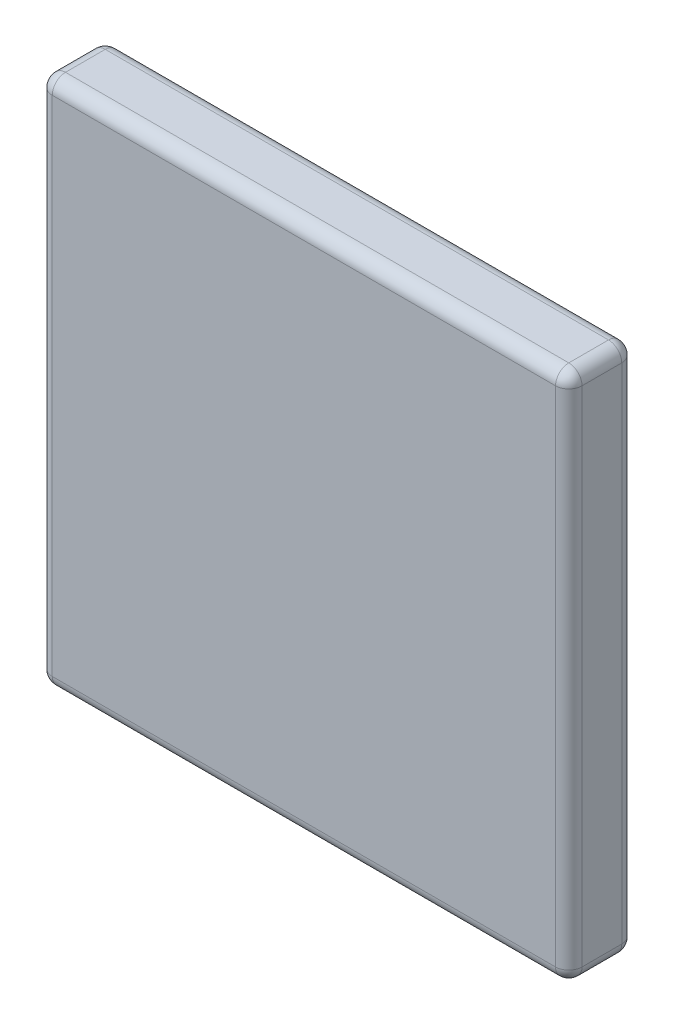
ISO-10303-21;
HEADER;
FILE_DESCRIPTION(('STEP AP214'),'2;1');
FILE_NAME('part.step','',(''),(''),'','','');
FILE_SCHEMA(('AUTOMOTIVE_DESIGN { 1 0 10303 214 1 1 1 1 }'));
ENDSEC;
DATA;
#1=APPLICATION_CONTEXT('core data for automotive mechanical design processes');
#2=APPLICATION_PROTOCOL_DEFINITION('international standard','automotive_design',2000,#1);
#3=PRODUCT_CONTEXT('',#1,'mechanical');
#4=PRODUCT('Part','Part','',(#3));
#5=PRODUCT_RELATED_PRODUCT_CATEGORY('part','',(#4));
#6=PRODUCT_DEFINITION_FORMATION('','',#4);
#7=PRODUCT_DEFINITION_CONTEXT('part definition',#1,'design');
#8=PRODUCT_DEFINITION('design','',#6,#7);
#9=PRODUCT_DEFINITION_SHAPE('','',#8);
#10=(LENGTH_UNIT() NAMED_UNIT(*) SI_UNIT(.MILLI.,.METRE.));
#11=(NAMED_UNIT(*) PLANE_ANGLE_UNIT() SI_UNIT($,.RADIAN.));
#12=(NAMED_UNIT(*) SI_UNIT($,.STERADIAN.) SOLID_ANGLE_UNIT());
#13=UNCERTAINTY_MEASURE_WITH_UNIT(LENGTH_MEASURE(1.E-05),#10,'distance_accuracy_value','');
#14=(GEOMETRIC_REPRESENTATION_CONTEXT(3) GLOBAL_UNCERTAINTY_ASSIGNED_CONTEXT((#13)) GLOBAL_UNIT_ASSIGNED_CONTEXT((#10,
#11,#12)) REPRESENTATION_CONTEXT('',''));
#15=CARTESIAN_POINT('',(0.,0.,0.));
#16=DIRECTION('',(0.,0.,1.));
#17=DIRECTION('',(1.,0.,0.));
#18=AXIS2_PLACEMENT_3D('',#15,#16,#17);
#19=CARTESIAN_POINT('',(-11.1135503341585,-6.92052800232944,0.900000000000082));
#20=DIRECTION('',(0.408248290462725,-0.816496580928247,0.408248290463959));
#21=DIRECTION('',(-0.912870929175786,-0.365148371669073,0.182574185834587));
#22=AXIS2_PLACEMENT_3D('',#19,#20,#21);
#23=SPHERICAL_SURFACE('',#22,0.0999999999998183);
#24=CARTESIAN_POINT('',(-11.1135503341584,-6.92052800232929,0.899999999999967));
#25=DIRECTION('',(-1.,0.,0.));
#26=DIRECTION('',(0.,-1.,0.));
#27=AXIS2_PLACEMENT_3D('',#24,#25,#26);
#28=CIRCLE('',#27,0.0999999999999996);
#29=CARTESIAN_POINT('',(-11.1135503341585,-7.02052800232926,0.899999999999986));
#30=VERTEX_POINT('',#29);
#31=CARTESIAN_POINT('',(-11.1135503341584,-6.92052800232928,0.799999999999992));
#32=VERTEX_POINT('',#31);
#33=EDGE_CURVE('E108',#30,#32,#28,.F.);
#34=ORIENTED_EDGE('',*,*,#33,.F.);
#35=CARTESIAN_POINT('',(-11.1135503341585,-6.92052800232926,0.900000000000005));
#36=DIRECTION('',(0.,0.,-1.));
#37=DIRECTION('',(-1.,0.,0.));
#38=AXIS2_PLACEMENT_3D('',#35,#36,#37);
#39=CIRCLE('',#38,0.0999999999999487);
#40=CARTESIAN_POINT('',(-11.2135503341584,-6.92052800232926,0.900000000000002));
#41=VERTEX_POINT('',#40);
#42=EDGE_CURVE('E20',#41,#30,#39,.F.);
#43=ORIENTED_EDGE('',*,*,#42,.F.);
#44=CARTESIAN_POINT('',(-11.1135503341584,-6.92052800232926,0.9));
#45=DIRECTION('',(0.,1.,0.));
#46=DIRECTION('',(0.,0.,1.));
#47=AXIS2_PLACEMENT_3D('',#44,#45,#46);
#48=CIRCLE('',#47,0.0999999999999994);
#49=EDGE_CURVE('E106',#32,#41,#48,.T.);
#50=ORIENTED_EDGE('',*,*,#49,.F.);
#51=EDGE_LOOP('',(#34,#43,#50));
#52=FACE_BOUND('',#51,.T.);
#53=ADVANCED_FACE('F16',(#52),#23,.T.);
#54=CARTESIAN_POINT('',(-11.1135503341585,-3.12052800232929,0.900000000000006));
#55=DIRECTION('',(-0.408248290463386,-0.816496580927873,-0.408248290464046));
#56=DIRECTION('',(-0.91287092917549,0.365148371669745,0.18257418583472));
#57=AXIS2_PLACEMENT_3D('',#54,#55,#56);
#58=SPHERICAL_SURFACE('',#57,0.0999999999998985);
#59=CARTESIAN_POINT('',(-11.1135503341584,-3.12052800232926,0.9));
#60=DIRECTION('',(1.,0.,0.));
#61=DIRECTION('',(0.,0.,-1.));
#62=AXIS2_PLACEMENT_3D('',#59,#60,#61);
#63=CIRCLE('',#62,0.0999999999999999);
#64=CARTESIAN_POINT('',(-11.1135503341584,-3.12052800232926,0.800000000000008));
#65=VERTEX_POINT('',#64);
#66=CARTESIAN_POINT('',(-11.1135503341584,-3.02052800232926,0.9));
#67=VERTEX_POINT('',#66);
#68=EDGE_CURVE('E198',#65,#67,#63,.T.);
#69=ORIENTED_EDGE('',*,*,#68,.F.);
#70=CARTESIAN_POINT('',(-11.1135503341584,-3.12052800232926,0.900000000000033));
#71=DIRECTION('',(0.,1.,0.));
#72=DIRECTION('',(0.,0.,1.));
#73=AXIS2_PLACEMENT_3D('',#70,#71,#72);
#74=CIRCLE('',#73,0.0999999999999994);
#75=CARTESIAN_POINT('',(-11.2135503341584,-3.12052800232926,0.900000000000017));
#76=VERTEX_POINT('',#75);
#77=EDGE_CURVE('E136',#76,#65,#74,.F.);
#78=ORIENTED_EDGE('',*,*,#77,.F.);
#79=CARTESIAN_POINT('',(-11.1135503341584,-3.12052800232926,0.9));
#80=DIRECTION('',(0.,0.,-1.));
#81=DIRECTION('',(-1.,0.,0.));
#82=AXIS2_PLACEMENT_3D('',#79,#80,#81);
#83=CIRCLE('',#82,0.0999999999999997);
#84=EDGE_CURVE('E112',#67,#76,#83,.F.);
#85=ORIENTED_EDGE('',*,*,#84,.F.);
#86=EDGE_LOOP('',(#69,#78,#85));
#87=FACE_BOUND('',#86,.T.);
#88=ADVANCED_FACE('F212',(#87),#58,.T.);
#89=CARTESIAN_POINT('',(-11.1135503341585,-6.92052800232926,1.2));
#90=DIRECTION('',(0.,0.,-1.));
#91=DIRECTION('',(-1.,0.,0.));
#92=AXIS2_PLACEMENT_3D('',#89,#90,#91);
#93=CYLINDRICAL_SURFACE('',#92,0.0999999999999487);
#94=ORIENTED_EDGE('',*,*,#42,.T.);
#95=DIRECTION('',(0.,0.,-1.));
#96=VECTOR('',#95,1.);
#97=CARTESIAN_POINT('',(-11.1135503341584,-7.02052800232926,1.05));
#98=LINE('',#97,#96);
#99=CARTESIAN_POINT('',(-11.1135503341585,-7.02052800232926,1.2));
#100=VERTEX_POINT('',#99);
#101=EDGE_CURVE('E195',#100,#30,#98,.T.);
#102=ORIENTED_EDGE('',*,*,#101,.F.);
#103=CARTESIAN_POINT('',(-11.1135503341585,-6.92052800232926,1.2));
#104=DIRECTION('',(0.,0.,-1.));
#105=DIRECTION('',(-1.,0.,0.));
#106=AXIS2_PLACEMENT_3D('',#103,#104,#105);
#107=CIRCLE('',#106,0.0999999999999487);
#108=CARTESIAN_POINT('',(-11.2135503341584,-6.92052800232926,1.2));
#109=VERTEX_POINT('',#108);
#110=EDGE_CURVE('E117',#109,#100,#107,.F.);
#111=ORIENTED_EDGE('',*,*,#110,.F.);
#112=DIRECTION('',(0.,0.,1.));
#113=VECTOR('',#112,1.);
#114=CARTESIAN_POINT('',(-11.2135503341584,-6.92052800232926,1.05));
#115=LINE('',#114,#113);
#116=EDGE_CURVE('E114',#41,#109,#115,.T.);
#117=ORIENTED_EDGE('',*,*,#116,.F.);
#118=EDGE_LOOP('',(#94,#102,#111,#117));
#119=FACE_BOUND('',#118,.T.);
#120=ADVANCED_FACE('F115',(#119),#93,.T.);
#121=CARTESIAN_POINT('',(-11.1135503341584,-3.12052800232926,1.2));
#122=DIRECTION('',(0.,0.,-1.));
#123=DIRECTION('',(-1.,0.,0.));
#124=AXIS2_PLACEMENT_3D('',#121,#122,#123);
#125=CYLINDRICAL_SURFACE('',#124,0.0999999999999997);
#126=ORIENTED_EDGE('',*,*,#84,.T.);
#127=DIRECTION('',(0.,0.,-1.));
#128=VECTOR('',#127,1.);
#129=CARTESIAN_POINT('',(-11.2135503341584,-3.12052800232926,1.05));
#130=LINE('',#129,#128);
#131=CARTESIAN_POINT('',(-11.2135503341584,-3.12052800232925,1.19999999999998));
#132=VERTEX_POINT('',#131);
#133=EDGE_CURVE('E123',#132,#76,#130,.T.);
#134=ORIENTED_EDGE('',*,*,#133,.F.);
#135=CARTESIAN_POINT('',(-11.1135503341584,-3.12052800232926,1.2));
#136=DIRECTION('',(0.,0.,-1.));
#137=DIRECTION('',(-1.,0.,0.));
#138=AXIS2_PLACEMENT_3D('',#135,#136,#137);
#139=CIRCLE('',#138,0.0999999999999997);
#140=CARTESIAN_POINT('',(-11.1135503341584,-3.02052800232926,1.2));
#141=VERTEX_POINT('',#140);
#142=EDGE_CURVE('E192',#141,#132,#139,.F.);
#143=ORIENTED_EDGE('',*,*,#142,.F.);
#144=DIRECTION('',(0.,0.,1.));
#145=VECTOR('',#144,1.);
#146=CARTESIAN_POINT('',(-11.1135503341584,-3.02052800232926,1.05));
#147=LINE('',#146,#145);
#148=EDGE_CURVE('E209',#67,#141,#147,.T.);
#149=ORIENTED_EDGE('',*,*,#148,.F.);
#150=EDGE_LOOP('',(#126,#134,#143,#149));
#151=FACE_BOUND('',#150,.T.);
#152=ADVANCED_FACE('F207',(#151),#125,.T.);
#153=CARTESIAN_POINT('',(-7.31355033415845,-6.92052800232926,0.9));
#154=DIRECTION('',(-1.,0.,0.));
#155=DIRECTION('',(0.,-1.,0.));
#156=AXIS2_PLACEMENT_3D('',#153,#154,#155);
#157=CYLINDRICAL_SURFACE('',#156,0.0999999999999996);
#158=ORIENTED_EDGE('',*,*,#33,.T.);
#159=DIRECTION('',(-1.,0.,0.));
#160=VECTOR('',#159,1.);
#161=CARTESIAN_POINT('',(-9.21355033415842,-6.92052800232926,0.8));
#162=LINE('',#161,#160);
#163=CARTESIAN_POINT('',(-7.31355033415844,-6.92052800232926,0.799999999999996));
#164=VERTEX_POINT('',#163);
#165=EDGE_CURVE('E225',#164,#32,#162,.T.);
#166=ORIENTED_EDGE('',*,*,#165,.F.);
#167=CARTESIAN_POINT('',(-7.31355033415845,-6.92052800232926,0.9));
#168=DIRECTION('',(-1.,0.,0.));
#169=DIRECTION('',(0.,-1.,0.));
#170=AXIS2_PLACEMENT_3D('',#167,#168,#169);
#171=CIRCLE('',#170,0.0999999999999996);
#172=CARTESIAN_POINT('',(-7.31355033415845,-7.02052800232926,0.9));
#173=VERTEX_POINT('',#172);
#174=EDGE_CURVE('E203',#164,#173,#171,.T.);
#175=ORIENTED_EDGE('',*,*,#174,.T.);
#176=DIRECTION('',(1.,0.,0.));
#177=VECTOR('',#176,1.);
#178=CARTESIAN_POINT('',(-9.21355033415842,-7.02052800232926,0.9));
#179=LINE('',#178,#177);
#180=EDGE_CURVE('E140',#30,#173,#179,.T.);
#181=ORIENTED_EDGE('',*,*,#180,.F.);
#182=EDGE_LOOP('',(#158,#166,#175,#181));
#183=FACE_BOUND('',#182,.T.);
#184=ADVANCED_FACE('F467',(#183),#157,.T.);
#185=CARTESIAN_POINT('',(-11.1135503341584,-6.92052800232926,0.9));
#186=DIRECTION('',(0.,1.,0.));
#187=DIRECTION('',(0.,0.,1.));
#188=AXIS2_PLACEMENT_3D('',#185,#186,#187);
#189=CYLINDRICAL_SURFACE('',#188,0.0999999999999994);
#190=ORIENTED_EDGE('',*,*,#77,.T.);
#191=DIRECTION('',(0.,1.,0.));
#192=VECTOR('',#191,1.);
#193=CARTESIAN_POINT('',(-11.1135503341584,-5.02052800232926,0.8));
#194=LINE('',#193,#192);
#195=EDGE_CURVE('E134',#32,#65,#194,.T.);
#196=ORIENTED_EDGE('',*,*,#195,.F.);
#197=ORIENTED_EDGE('',*,*,#49,.T.);
#198=DIRECTION('',(0.,-1.,0.));
#199=VECTOR('',#198,1.);
#200=CARTESIAN_POINT('',(-11.2135503341584,-5.02052800232926,0.9));
#201=LINE('',#200,#199);
#202=EDGE_CURVE('E131',#76,#41,#201,.T.);
#203=ORIENTED_EDGE('',*,*,#202,.F.);
#204=EDGE_LOOP('',(#190,#196,#197,#203));
#205=FACE_BOUND('',#204,.T.);
#206=ADVANCED_FACE('F130',(#205),#189,.T.);
#207=CARTESIAN_POINT('',(-11.1135503341584,-3.12052800232926,0.9));
#208=DIRECTION('',(1.,0.,0.));
#209=DIRECTION('',(0.,0.,-1.));
#210=AXIS2_PLACEMENT_3D('',#207,#208,#209);
#211=CYLINDRICAL_SURFACE('',#210,0.0999999999999999);
#212=CARTESIAN_POINT('',(-7.31355033415845,-3.12052800232926,0.9));
#213=DIRECTION('',(1.,0.,0.));
#214=DIRECTION('',(0.,0.,-1.));
#215=AXIS2_PLACEMENT_3D('',#212,#213,#214);
#216=CIRCLE('',#215,0.0999999999999999);
#217=CARTESIAN_POINT('',(-7.31355033415845,-3.02052800232926,0.9));
#218=VERTEX_POINT('',#217);
#219=CARTESIAN_POINT('',(-7.31355033415845,-3.12052800232926,0.8));
#220=VERTEX_POINT('',#219);
#221=EDGE_CURVE('E124',#218,#220,#216,.F.);
#222=ORIENTED_EDGE('',*,*,#221,.T.);
#223=DIRECTION('',(1.,0.,0.));
#224=VECTOR('',#223,1.);
#225=CARTESIAN_POINT('',(-9.21355033415842,-3.12052800232926,0.8));
#226=LINE('',#225,#224);
#227=EDGE_CURVE('E191',#65,#220,#226,.T.);
#228=ORIENTED_EDGE('',*,*,#227,.F.);
#229=ORIENTED_EDGE('',*,*,#68,.T.);
#230=DIRECTION('',(-1.,0.,0.));
#231=VECTOR('',#230,1.);
#232=CARTESIAN_POINT('',(-9.21355033415842,-3.02052800232926,0.9));
#233=LINE('',#232,#231);
#234=EDGE_CURVE('E194',#218,#67,#233,.T.);
#235=ORIENTED_EDGE('',*,*,#234,.F.);
#236=EDGE_LOOP('',(#222,#228,#229,#235));
#237=FACE_BOUND('',#236,.T.);
#238=ADVANCED_FACE('F216',(#237),#211,.T.);
#239=CARTESIAN_POINT('',(-11.2135503341584,-3.12052800232926,0.9));
#240=DIRECTION('',(-1.,0.,0.));
#241=DIRECTION('',(0.,-1.,0.));
#242=AXIS2_PLACEMENT_3D('',#239,#240,#241);
#243=PLANE('',#242);
#244=ORIENTED_EDGE('',*,*,#133,.T.);
#245=ORIENTED_EDGE('',*,*,#202,.T.);
#246=ORIENTED_EDGE('',*,*,#116,.T.);
#247=DIRECTION('',(0.,-1.,0.));
#248=VECTOR('',#247,1.);
#249=CARTESIAN_POINT('',(-11.2135503341584,-5.02052800232926,1.2));
#250=LINE('',#249,#248);
#251=EDGE_CURVE('E184',#132,#109,#250,.T.);
#252=ORIENTED_EDGE('',*,*,#251,.F.);
#253=EDGE_LOOP('',(#244,#245,#246,#252));
#254=FACE_BOUND('',#253,.T.);
#255=ADVANCED_FACE('F138',(#254),#243,.T.);
#256=CARTESIAN_POINT('',(-11.1135503341584,-6.92052800232923,1.19999999999998));
#257=DIRECTION('',(0.408248290463794,-0.816496580928217,-0.408248290462949));
#258=DIRECTION('',(0.182574185834408,-0.365148371669412,0.912870929175686));
#259=AXIS2_PLACEMENT_3D('',#256,#257,#258);
#260=SPHERICAL_SURFACE('',#259,0.100000000000031);
#261=ORIENTED_EDGE('',*,*,#110,.T.);
#262=CARTESIAN_POINT('',(-11.1135503341584,-6.92052800232929,1.20000000000003));
#263=DIRECTION('',(-1.,0.,0.));
#264=DIRECTION('',(0.,-1.,0.));
#265=AXIS2_PLACEMENT_3D('',#262,#263,#264);
#266=CIRCLE('',#265,0.0999999999999997);
#267=CARTESIAN_POINT('',(-11.1135503341584,-6.92052800232928,1.30000000000001));
#268=VERTEX_POINT('',#267);
#269=EDGE_CURVE('E179',#268,#100,#266,.F.);
#270=ORIENTED_EDGE('',*,*,#269,.F.);
#271=CARTESIAN_POINT('',(-11.1135503341584,-6.92052800232926,1.2));
#272=DIRECTION('',(0.,1.,0.));
#273=DIRECTION('',(-1.,0.,0.));
#274=AXIS2_PLACEMENT_3D('',#271,#272,#273);
#275=CIRCLE('',#274,0.0999999999999999);
#276=EDGE_CURVE('E188',#109,#268,#275,.T.);
#277=ORIENTED_EDGE('',*,*,#276,.F.);
#278=EDGE_LOOP('',(#261,#270,#277));
#279=FACE_BOUND('',#278,.T.);
#280=ADVANCED_FACE('F291',(#279),#260,.T.);
#281=CARTESIAN_POINT('',(-11.1135503341584,-7.02052800232926,0.9));
#282=DIRECTION('',(0.,-1.,0.));
#283=DIRECTION('',(1.,0.,0.));
#284=AXIS2_PLACEMENT_3D('',#281,#282,#283);
#285=PLANE('',#284);
#286=DIRECTION('',(1.,0.,0.));
#287=VECTOR('',#286,1.);
#288=CARTESIAN_POINT('',(-9.21355033415842,-7.02052800232926,1.2));
#289=LINE('',#288,#287);
#290=CARTESIAN_POINT('',(-7.31355033415845,-7.02052800232926,1.2));
#291=VERTEX_POINT('',#290);
#292=EDGE_CURVE('E178',#100,#291,#289,.T.);
#293=ORIENTED_EDGE('',*,*,#292,.F.);
#294=ORIENTED_EDGE('',*,*,#101,.T.);
#295=ORIENTED_EDGE('',*,*,#180,.T.);
#296=DIRECTION('',(0.,0.,1.));
#297=VECTOR('',#296,1.);
#298=CARTESIAN_POINT('',(-7.31355033415845,-7.02052800232926,1.05));
#299=LINE('',#298,#297);
#300=EDGE_CURVE('E239',#173,#291,#299,.T.);
#301=ORIENTED_EDGE('',*,*,#300,.T.);
#302=EDGE_LOOP('',(#293,#294,#295,#301));
#303=FACE_BOUND('',#302,.T.);
#304=ADVANCED_FACE('F287',(#303),#285,.T.);
#305=CARTESIAN_POINT('',(-11.1135503341585,-3.12052800232924,1.19999999999999));
#306=DIRECTION('',(-0.408248290463997,-0.816496580927973,0.408248290463235));
#307=DIRECTION('',(0.182574185835505,0.365148371669184,0.912870929175558));
#308=AXIS2_PLACEMENT_3D('',#305,#306,#307);
#309=SPHERICAL_SURFACE('',#308,0.10000000000001);
#310=ORIENTED_EDGE('',*,*,#142,.T.);
#311=CARTESIAN_POINT('',(-11.1135503341584,-3.12052800232925,1.19999999999997));
#312=DIRECTION('',(0.,1.,0.));
#313=DIRECTION('',(-1.,0.,0.));
#314=AXIS2_PLACEMENT_3D('',#311,#312,#313);
#315=CIRCLE('',#314,0.0999999999999999);
#316=CARTESIAN_POINT('',(-11.1135503341584,-3.12052800232925,1.29999999999999));
#317=VERTEX_POINT('',#316);
#318=EDGE_CURVE('E185',#317,#132,#315,.F.);
#319=ORIENTED_EDGE('',*,*,#318,.F.);
#320=CARTESIAN_POINT('',(-11.1135503341584,-3.12052800232926,1.2));
#321=DIRECTION('',(1.,0.,0.));
#322=DIRECTION('',(0.,0.,-1.));
#323=AXIS2_PLACEMENT_3D('',#320,#321,#322);
#324=CIRCLE('',#323,0.1);
#325=EDGE_CURVE('E175',#141,#317,#324,.T.);
#326=ORIENTED_EDGE('',*,*,#325,.F.);
#327=EDGE_LOOP('',(#310,#319,#326));
#328=FACE_BOUND('',#327,.T.);
#329=ADVANCED_FACE('F249',(#328),#309,.T.);
#330=CARTESIAN_POINT('',(-7.31355033415845,-3.02052800232926,0.9));
#331=DIRECTION('',(0.,1.,0.));
#332=DIRECTION('',(-1.,0.,0.));
#333=AXIS2_PLACEMENT_3D('',#330,#331,#332);
#334=PLANE('',#333);
#335=DIRECTION('',(-1.,0.,0.));
#336=VECTOR('',#335,1.);
#337=CARTESIAN_POINT('',(-9.21355033415842,-3.02052800232926,1.2));
#338=LINE('',#337,#336);
#339=CARTESIAN_POINT('',(-7.31355033415845,-3.02052800232926,1.2));
#340=VERTEX_POINT('',#339);
#341=EDGE_CURVE('E174',#340,#141,#338,.T.);
#342=ORIENTED_EDGE('',*,*,#341,.F.);
#343=DIRECTION('',(0.,0.,-1.));
#344=VECTOR('',#343,1.);
#345=CARTESIAN_POINT('',(-7.31355033415845,-3.02052800232926,1.05));
#346=LINE('',#345,#344);
#347=EDGE_CURVE('E227',#340,#218,#346,.T.);
#348=ORIENTED_EDGE('',*,*,#347,.T.);
#349=ORIENTED_EDGE('',*,*,#234,.T.);
#350=ORIENTED_EDGE('',*,*,#148,.T.);
#351=EDGE_LOOP('',(#342,#348,#349,#350));
#352=FACE_BOUND('',#351,.T.);
#353=ADVANCED_FACE('F424',(#352),#334,.T.);
#354=CARTESIAN_POINT('',(-7.31355033415845,-6.92052800232926,0.8));
#355=DIRECTION('',(0.,0.,-1.));
#356=DIRECTION('',(-1.,0.,0.));
#357=AXIS2_PLACEMENT_3D('',#354,#355,#356);
#358=PLANE('',#357);
#359=ORIENTED_EDGE('',*,*,#195,.T.);
#360=ORIENTED_EDGE('',*,*,#227,.T.);
#361=DIRECTION('',(0.,1.,0.));
#362=VECTOR('',#361,1.);
#363=CARTESIAN_POINT('',(-7.31355033415845,-5.02052800232926,0.8));
#364=LINE('',#363,#362);
#365=EDGE_CURVE('E170',#164,#220,#364,.T.);
#366=ORIENTED_EDGE('',*,*,#365,.F.);
#367=ORIENTED_EDGE('',*,*,#165,.T.);
#368=EDGE_LOOP('',(#359,#360,#366,#367));
#369=FACE_BOUND('',#368,.T.);
#370=ADVANCED_FACE('F223',(#369),#358,.T.);
#371=CARTESIAN_POINT('',(-7.31355033415846,-3.12052800232928,0.899999999999996));
#372=DIRECTION('',(0.40824829046393,-0.816496580927607,-0.408248290464035));
#373=DIRECTION('',(-0.182574185835001,0.36514837167033,-0.9128709291752));
#374=AXIS2_PLACEMENT_3D('',#371,#372,#373);
#375=SPHERICAL_SURFACE('',#374,0.0999999999999972);
#376=CARTESIAN_POINT('',(-7.31355033415845,-3.12052800232926,0.9));
#377=DIRECTION('',(0.,-1.,0.));
#378=DIRECTION('',(1.,0.,0.));
#379=AXIS2_PLACEMENT_3D('',#376,#377,#378);
#380=CIRCLE('',#379,0.0999999999999996);
#381=CARTESIAN_POINT('',(-7.21355033415845,-3.12052800232926,0.9));
#382=VERTEX_POINT('',#381);
#383=EDGE_CURVE('E171',#220,#382,#380,.T.);
#384=ORIENTED_EDGE('',*,*,#383,.F.);
#385=ORIENTED_EDGE('',*,*,#221,.F.);
#386=CARTESIAN_POINT('',(-7.31355033415845,-3.12052800232926,0.9));
#387=DIRECTION('',(0.,0.,-1.));
#388=DIRECTION('',(-1.,0.,0.));
#389=AXIS2_PLACEMENT_3D('',#386,#387,#388);
#390=CIRCLE('',#389,0.0999999999999995);
#391=EDGE_CURVE('E167',#382,#218,#390,.F.);
#392=ORIENTED_EDGE('',*,*,#391,.F.);
#393=EDGE_LOOP('',(#384,#385,#392));
#394=FACE_BOUND('',#393,.T.);
#395=ADVANCED_FACE('F408',(#394),#375,.T.);
#396=CARTESIAN_POINT('',(-11.1135503341584,-6.92052800232926,1.2));
#397=DIRECTION('',(0.,1.,0.));
#398=DIRECTION('',(-1.,0.,0.));
#399=AXIS2_PLACEMENT_3D('',#396,#397,#398);
#400=CYLINDRICAL_SURFACE('',#399,0.0999999999999999);
#401=ORIENTED_EDGE('',*,*,#318,.T.);
#402=ORIENTED_EDGE('',*,*,#251,.T.);
#403=ORIENTED_EDGE('',*,*,#276,.T.);
#404=DIRECTION('',(0.,-1.,0.));
#405=VECTOR('',#404,1.);
#406=CARTESIAN_POINT('',(-11.1135503341584,-5.02052800232926,1.3));
#407=LINE('',#406,#405);
#408=EDGE_CURVE('E160',#317,#268,#407,.T.);
#409=ORIENTED_EDGE('',*,*,#408,.F.);
#410=EDGE_LOOP('',(#401,#402,#403,#409));
#411=FACE_BOUND('',#410,.T.);
#412=ADVANCED_FACE('F243',(#411),#400,.T.);
#413=CARTESIAN_POINT('',(-7.31355033415845,-6.92052800232926,1.2));
#414=DIRECTION('',(-1.,0.,0.));
#415=DIRECTION('',(0.,-1.,0.));
#416=AXIS2_PLACEMENT_3D('',#413,#414,#415);
#417=CYLINDRICAL_SURFACE('',#416,0.0999999999999997);
#418=ORIENTED_EDGE('',*,*,#269,.T.);
#419=ORIENTED_EDGE('',*,*,#292,.T.);
#420=CARTESIAN_POINT('',(-7.31355033415845,-6.92052800232926,1.2));
#421=DIRECTION('',(-1.,0.,0.));
#422=DIRECTION('',(0.,-1.,0.));
#423=AXIS2_PLACEMENT_3D('',#420,#421,#422);
#424=CIRCLE('',#423,0.0999999999999997);
#425=CARTESIAN_POINT('',(-7.31355033415844,-6.92052800232926,1.3));
#426=VERTEX_POINT('',#425);
#427=EDGE_CURVE('E182',#291,#426,#424,.T.);
#428=ORIENTED_EDGE('',*,*,#427,.T.);
#429=DIRECTION('',(1.,0.,0.));
#430=VECTOR('',#429,1.);
#431=CARTESIAN_POINT('',(-9.21355033415842,-6.92052800232926,1.3));
#432=LINE('',#431,#430);
#433=EDGE_CURVE('E261',#268,#426,#432,.T.);
#434=ORIENTED_EDGE('',*,*,#433,.F.);
#435=EDGE_LOOP('',(#418,#419,#428,#434));
#436=FACE_BOUND('',#435,.T.);
#437=ADVANCED_FACE('F289',(#436),#417,.T.);
#438=CARTESIAN_POINT('',(-11.1135503341584,-3.12052800232926,1.2));
#439=DIRECTION('',(1.,0.,0.));
#440=DIRECTION('',(0.,0.,-1.));
#441=AXIS2_PLACEMENT_3D('',#438,#439,#440);
#442=CYLINDRICAL_SURFACE('',#441,0.1);
#443=CARTESIAN_POINT('',(-7.31355033415845,-3.12052800232926,1.2));
#444=DIRECTION('',(1.,0.,0.));
#445=DIRECTION('',(0.,0.,-1.));
#446=AXIS2_PLACEMENT_3D('',#443,#444,#445);
#447=CIRCLE('',#446,0.1);
#448=CARTESIAN_POINT('',(-7.31355033415845,-3.12052800232926,1.3));
#449=VERTEX_POINT('',#448);
#450=EDGE_CURVE('E157',#340,#449,#447,.T.);
#451=ORIENTED_EDGE('',*,*,#450,.F.);
#452=ORIENTED_EDGE('',*,*,#341,.T.);
#453=ORIENTED_EDGE('',*,*,#325,.T.);
#454=DIRECTION('',(-1.,0.,0.));
#455=VECTOR('',#454,1.);
#456=CARTESIAN_POINT('',(-9.21355033415842,-3.12052800232926,1.3));
#457=LINE('',#456,#455);
#458=EDGE_CURVE('E254',#449,#317,#457,.T.);
#459=ORIENTED_EDGE('',*,*,#458,.F.);
#460=EDGE_LOOP('',(#451,#452,#453,#459));
#461=FACE_BOUND('',#460,.T.);
#462=ADVANCED_FACE('F253',(#461),#442,.T.);
#463=CARTESIAN_POINT('',(-7.31355033415845,-3.12052800232926,0.9));
#464=DIRECTION('',(0.,-1.,0.));
#465=DIRECTION('',(1.,0.,0.));
#466=AXIS2_PLACEMENT_3D('',#463,#464,#465);
#467=CYLINDRICAL_SURFACE('',#466,0.0999999999999996);
#468=CARTESIAN_POINT('',(-7.31355033415843,-6.92052800232926,0.899999999999984));
#469=DIRECTION('',(0.,-1.,0.));
#470=DIRECTION('',(1.,0.,0.));
#471=AXIS2_PLACEMENT_3D('',#468,#469,#470);
#472=CIRCLE('',#471,0.0999999999999996);
#473=CARTESIAN_POINT('',(-7.21355033415844,-6.92052800232926,0.899999999999992));
#474=VERTEX_POINT('',#473);
#475=EDGE_CURVE('E164',#164,#474,#472,.T.);
#476=ORIENTED_EDGE('',*,*,#475,.F.);
#477=ORIENTED_EDGE('',*,*,#365,.T.);
#478=ORIENTED_EDGE('',*,*,#383,.T.);
#479=DIRECTION('',(0.,1.,0.));
#480=VECTOR('',#479,1.);
#481=CARTESIAN_POINT('',(-7.21355033415845,-5.02052800232926,0.9));
#482=LINE('',#481,#480);
#483=EDGE_CURVE('E260',#474,#382,#482,.T.);
#484=ORIENTED_EDGE('',*,*,#483,.F.);
#485=EDGE_LOOP('',(#476,#477,#478,#484));
#486=FACE_BOUND('',#485,.T.);
#487=ADVANCED_FACE('F272',(#486),#467,.T.);
#488=CARTESIAN_POINT('',(-7.31355033415845,-3.12052800232926,1.2));
#489=DIRECTION('',(0.,0.,-1.));
#490=DIRECTION('',(-1.,0.,0.));
#491=AXIS2_PLACEMENT_3D('',#488,#489,#490);
#492=CYLINDRICAL_SURFACE('',#491,0.0999999999999995);
#493=ORIENTED_EDGE('',*,*,#391,.T.);
#494=ORIENTED_EDGE('',*,*,#347,.F.);
#495=CARTESIAN_POINT('',(-7.31355033415845,-3.12052800232926,1.2));
#496=DIRECTION('',(0.,0.,-1.));
#497=DIRECTION('',(-1.,0.,0.));
#498=AXIS2_PLACEMENT_3D('',#495,#496,#497);
#499=CIRCLE('',#498,0.0999999999999995);
#500=CARTESIAN_POINT('',(-7.21355033415845,-3.12052800232926,1.2));
#501=VERTEX_POINT('',#500);
#502=EDGE_CURVE('E161',#501,#340,#499,.F.);
#503=ORIENTED_EDGE('',*,*,#502,.F.);
#504=DIRECTION('',(0.,0.,1.));
#505=VECTOR('',#504,1.);
#506=CARTESIAN_POINT('',(-7.21355033415845,-3.12052800232926,1.05));
#507=LINE('',#506,#505);
#508=EDGE_CURVE('E156',#382,#501,#507,.T.);
#509=ORIENTED_EDGE('',*,*,#508,.F.);
#510=EDGE_LOOP('',(#493,#494,#503,#509));
#511=FACE_BOUND('',#510,.T.);
#512=ADVANCED_FACE('F312',(#511),#492,.T.);
#513=CARTESIAN_POINT('',(-7.31355033415846,-6.92052800232923,0.900000000000024));
#514=DIRECTION('',(-0.408248290463759,-0.816496580927779,0.408248290463862));
#515=DIRECTION('',(-0.182574185834896,-0.365148371670189,-0.912870929175277));
#516=AXIS2_PLACEMENT_3D('',#513,#514,#515);
#517=SPHERICAL_SURFACE('',#516,0.100000000000033);
#518=ORIENTED_EDGE('',*,*,#174,.F.);
#519=ORIENTED_EDGE('',*,*,#475,.T.);
#520=CARTESIAN_POINT('',(-7.31355033415845,-6.92052800232926,0.9));
#521=DIRECTION('',(0.,0.,-1.));
#522=DIRECTION('',(-1.,0.,0.));
#523=AXIS2_PLACEMENT_3D('',#520,#521,#522);
#524=CIRCLE('',#523,0.0999999999999992);
#525=EDGE_CURVE('E153',#173,#474,#524,.F.);
#526=ORIENTED_EDGE('',*,*,#525,.F.);
#527=EDGE_LOOP('',(#518,#519,#526));
#528=FACE_BOUND('',#527,.T.);
#529=ADVANCED_FACE('F276',(#528),#517,.T.);
#530=CARTESIAN_POINT('',(-7.31355033415845,-3.12052800232928,1.19999999999998));
#531=DIRECTION('',(0.408248290464107,-0.816496580927574,0.408248290463924));
#532=DIRECTION('',(0.912870929175168,0.365148371670435,-0.182574185834952));
#533=AXIS2_PLACEMENT_3D('',#530,#531,#532);
#534=SPHERICAL_SURFACE('',#533,0.0999999999999971);
#535=ORIENTED_EDGE('',*,*,#502,.T.);
#536=ORIENTED_EDGE('',*,*,#450,.T.);
#537=CARTESIAN_POINT('',(-7.31355033415845,-3.12052800232926,1.2));
#538=DIRECTION('',(0.,-1.,0.));
#539=DIRECTION('',(1.,0.,0.));
#540=AXIS2_PLACEMENT_3D('',#537,#538,#539);
#541=CIRCLE('',#540,0.0999999999999997);
#542=EDGE_CURVE('E148',#501,#449,#541,.T.);
#543=ORIENTED_EDGE('',*,*,#542,.F.);
#544=EDGE_LOOP('',(#535,#536,#543));
#545=FACE_BOUND('',#544,.T.);
#546=ADVANCED_FACE('F314',(#545),#534,.T.);
#547=CARTESIAN_POINT('',(-11.1135503341584,-6.92052800232926,1.3));
#548=DIRECTION('',(0.,0.,1.));
#549=DIRECTION('',(1.,0.,0.));
#550=AXIS2_PLACEMENT_3D('',#547,#548,#549);
#551=PLANE('',#550);
#552=DIRECTION('',(0.,-1.,0.));
#553=VECTOR('',#552,1.);
#554=CARTESIAN_POINT('',(-7.31355033415845,-5.02052800232926,1.3));
#555=LINE('',#554,#553);
#556=EDGE_CURVE('E151',#449,#426,#555,.T.);
#557=ORIENTED_EDGE('',*,*,#556,.F.);
#558=ORIENTED_EDGE('',*,*,#458,.T.);
#559=ORIENTED_EDGE('',*,*,#408,.T.);
#560=ORIENTED_EDGE('',*,*,#433,.T.);
#561=EDGE_LOOP('',(#557,#558,#559,#560));
#562=FACE_BOUND('',#561,.T.);
#563=ADVANCED_FACE('F257',(#562),#551,.T.);
#564=CARTESIAN_POINT('',(-7.21355033415845,-6.92052800232926,0.9));
#565=DIRECTION('',(1.,0.,0.));
#566=DIRECTION('',(0.,1.,0.));
#567=AXIS2_PLACEMENT_3D('',#564,#565,#566);
#568=PLANE('',#567);
#569=DIRECTION('',(0.,1.,0.));
#570=VECTOR('',#569,1.);
#571=CARTESIAN_POINT('',(-7.21355033415845,-5.02052800232926,1.2));
#572=LINE('',#571,#570);
#573=CARTESIAN_POINT('',(-7.21355033415844,-6.92052800232926,1.20000000000001));
#574=VERTEX_POINT('',#573);
#575=EDGE_CURVE('E35',#574,#501,#572,.T.);
#576=ORIENTED_EDGE('',*,*,#575,.F.);
#577=DIRECTION('',(0.,0.,1.));
#578=VECTOR('',#577,1.);
#579=CARTESIAN_POINT('',(-7.21355033415845,-6.92052800232926,1.05));
#580=LINE('',#579,#578);
#581=EDGE_CURVE('E152',#474,#574,#580,.T.);
#582=ORIENTED_EDGE('',*,*,#581,.F.);
#583=ORIENTED_EDGE('',*,*,#483,.T.);
#584=ORIENTED_EDGE('',*,*,#508,.T.);
#585=EDGE_LOOP('',(#576,#582,#583,#584));
#586=FACE_BOUND('',#585,.T.);
#587=ADVANCED_FACE('F278',(#586),#568,.T.);
#588=CARTESIAN_POINT('',(-7.31355033415845,-6.92052800232926,1.2));
#589=DIRECTION('',(0.,0.,-1.));
#590=DIRECTION('',(-1.,0.,0.));
#591=AXIS2_PLACEMENT_3D('',#588,#589,#590);
#592=CYLINDRICAL_SURFACE('',#591,0.0999999999999992);
#593=ORIENTED_EDGE('',*,*,#525,.T.);
#594=ORIENTED_EDGE('',*,*,#581,.T.);
#595=CARTESIAN_POINT('',(-7.31355033415845,-6.92052800232926,1.2));
#596=DIRECTION('',(0.,0.,-1.));
#597=DIRECTION('',(-1.,0.,0.));
#598=AXIS2_PLACEMENT_3D('',#595,#596,#597);
#599=CIRCLE('',#598,0.0999999999999992);
#600=EDGE_CURVE('E26',#291,#574,#599,.F.);
#601=ORIENTED_EDGE('',*,*,#600,.F.);
#602=ORIENTED_EDGE('',*,*,#300,.F.);
#603=EDGE_LOOP('',(#593,#594,#601,#602));
#604=FACE_BOUND('',#603,.T.);
#605=ADVANCED_FACE('F284',(#604),#592,.T.);
#606=CARTESIAN_POINT('',(-7.31355033415845,-3.12052800232926,1.2));
#607=DIRECTION('',(0.,-1.,0.));
#608=DIRECTION('',(1.,0.,0.));
#609=AXIS2_PLACEMENT_3D('',#606,#607,#608);
#610=CYLINDRICAL_SURFACE('',#609,0.0999999999999997);
#611=CARTESIAN_POINT('',(-7.31355033415843,-6.92052800232926,1.20000000000002));
#612=DIRECTION('',(0.,-1.,0.));
#613=DIRECTION('',(1.,0.,0.));
#614=AXIS2_PLACEMENT_3D('',#611,#612,#613);
#615=CIRCLE('',#614,0.0999999999999997);
#616=EDGE_CURVE('E11',#574,#426,#615,.T.);
#617=ORIENTED_EDGE('',*,*,#616,.F.);
#618=ORIENTED_EDGE('',*,*,#575,.T.);
#619=ORIENTED_EDGE('',*,*,#542,.T.);
#620=ORIENTED_EDGE('',*,*,#556,.T.);
#621=EDGE_LOOP('',(#617,#618,#619,#620));
#622=FACE_BOUND('',#621,.T.);
#623=ADVANCED_FACE('F302',(#622),#610,.T.);
#624=CARTESIAN_POINT('',(-7.31355033415846,-6.92052800232926,1.20000000000003));
#625=DIRECTION('',(-0.408248290463818,-0.816496580927803,-0.408248290463754));
#626=DIRECTION('',(0.912870929175297,-0.365148371669959,-0.182574185835256));
#627=AXIS2_PLACEMENT_3D('',#624,#625,#626);
#628=SPHERICAL_SURFACE('',#627,0.100000000000019);
#629=ORIENTED_EDGE('',*,*,#600,.T.);
#630=ORIENTED_EDGE('',*,*,#616,.T.);
#631=ORIENTED_EDGE('',*,*,#427,.F.);
#632=EDGE_LOOP('',(#629,#630,#631));
#633=FACE_BOUND('',#632,.T.);
#634=ADVANCED_FACE('F18',(#633),#628,.T.);
#635=CLOSED_SHELL('',(#53,#88,#120,#152,#184,#206,#238,#255,#280,#304,#329,#353,#370,#395,#412,
#437,#462,#487,#512,#529,#546,#563,#587,#605,#623,#634));
#636=MANIFOLD_SOLID_BREP('B1',#635);
#637=ADVANCED_BREP_SHAPE_REPRESENTATION('',(#18,#636),#14);
#638=SHAPE_DEFINITION_REPRESENTATION(#9,#637);
ENDSEC;
END-ISO-10303-21;
